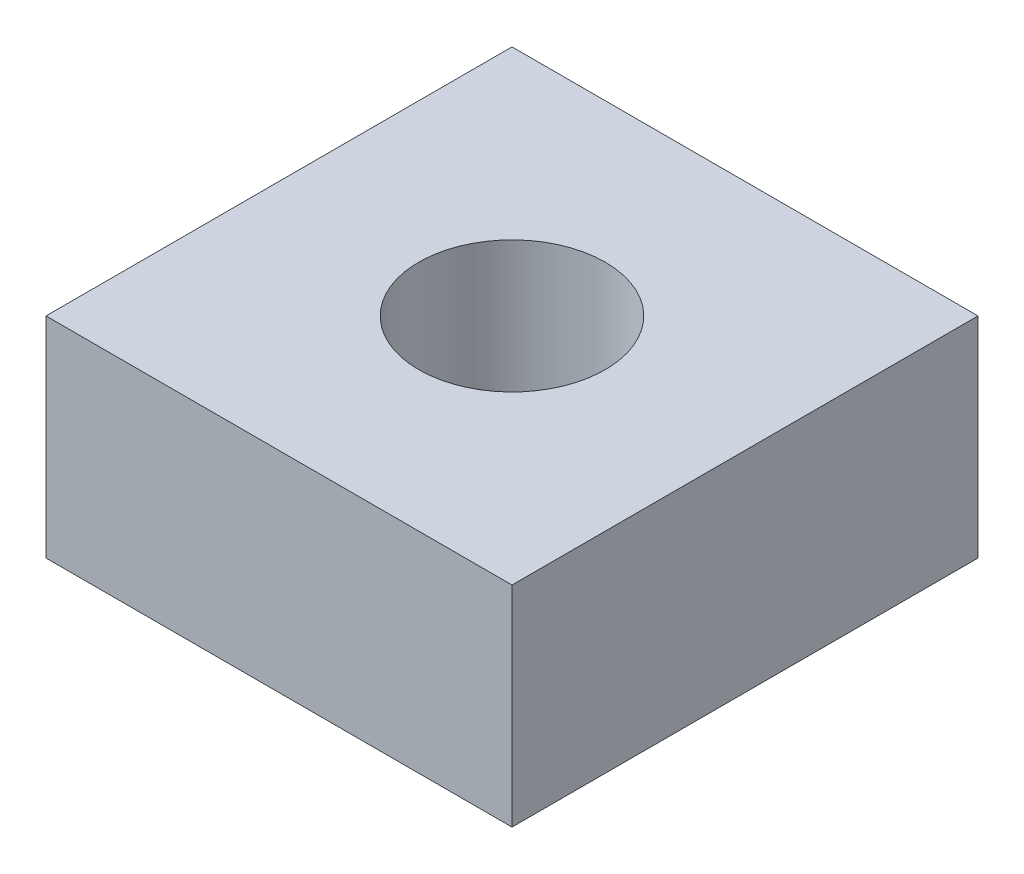
ISO-10303-21;
HEADER;
FILE_DESCRIPTION(('STEP AP214'),'2;1');
FILE_NAME('part.step','',(''),(''),'','','');
FILE_SCHEMA(('AUTOMOTIVE_DESIGN { 1 0 10303 214 1 1 1 1 }'));
ENDSEC;
DATA;
#1=APPLICATION_CONTEXT('core data for automotive mechanical design processes');
#2=APPLICATION_PROTOCOL_DEFINITION('international standard','automotive_design',2000,#1);
#3=PRODUCT_CONTEXT('',#1,'mechanical');
#4=PRODUCT('Part','Part','',(#3));
#5=PRODUCT_RELATED_PRODUCT_CATEGORY('part','',(#4));
#6=PRODUCT_DEFINITION_FORMATION('','',#4);
#7=PRODUCT_DEFINITION_CONTEXT('part definition',#1,'design');
#8=PRODUCT_DEFINITION('design','',#6,#7);
#9=PRODUCT_DEFINITION_SHAPE('','',#8);
#10=(LENGTH_UNIT() NAMED_UNIT(*) SI_UNIT(.MILLI.,.METRE.));
#11=(NAMED_UNIT(*) PLANE_ANGLE_UNIT() SI_UNIT($,.RADIAN.));
#12=(NAMED_UNIT(*) SI_UNIT($,.STERADIAN.) SOLID_ANGLE_UNIT());
#13=UNCERTAINTY_MEASURE_WITH_UNIT(LENGTH_MEASURE(1.E-05),#10,'distance_accuracy_value','');
#14=(GEOMETRIC_REPRESENTATION_CONTEXT(3) GLOBAL_UNCERTAINTY_ASSIGNED_CONTEXT((#13)) GLOBAL_UNIT_ASSIGNED_CONTEXT((#10,
#11,#12)) REPRESENTATION_CONTEXT('',''));
#15=CARTESIAN_POINT('',(0.,0.,0.));
#16=DIRECTION('',(0.,0.,1.));
#17=DIRECTION('',(1.,0.,0.));
#18=AXIS2_PLACEMENT_3D('',#15,#16,#17);
#19=CARTESIAN_POINT('',(0.,4.5,0.));
#20=DIRECTION('',(0.,1.,0.));
#21=DIRECTION('',(0.,0.,1.));
#22=AXIS2_PLACEMENT_3D('',#19,#20,#21);
#23=PLANE('',#22);
#24=DIRECTION('',(0.,0.,1.));
#25=VECTOR('',#24,1.);
#26=CARTESIAN_POINT('',(-5.,4.5,5.));
#27=LINE('',#26,#25);
#28=CARTESIAN_POINT('',(-5.,4.5,-5.));
#29=VERTEX_POINT('',#28);
#30=CARTESIAN_POINT('',(-5.,4.5,5.));
#31=VERTEX_POINT('',#30);
#32=EDGE_CURVE('E84',#29,#31,#27,.T.);
#33=ORIENTED_EDGE('',*,*,#32,.T.);
#34=DIRECTION('',(1.,0.,0.));
#35=VECTOR('',#34,1.);
#36=CARTESIAN_POINT('',(5.,4.5,5.));
#37=LINE('',#36,#35);
#38=CARTESIAN_POINT('',(5.,4.5,5.));
#39=VERTEX_POINT('',#38);
#40=EDGE_CURVE('E79',#31,#39,#37,.T.);
#41=ORIENTED_EDGE('',*,*,#40,.T.);
#42=DIRECTION('',(0.,0.,-1.));
#43=VECTOR('',#42,1.);
#44=CARTESIAN_POINT('',(5.,4.5,5.));
#45=LINE('',#44,#43);
#46=CARTESIAN_POINT('',(5.,4.5,-5.));
#47=VERTEX_POINT('',#46);
#48=EDGE_CURVE('E82',#39,#47,#45,.T.);
#49=ORIENTED_EDGE('',*,*,#48,.T.);
#50=DIRECTION('',(-1.,0.,0.));
#51=VECTOR('',#50,1.);
#52=CARTESIAN_POINT('',(5.,4.5,-5.));
#53=LINE('',#52,#51);
#54=EDGE_CURVE('E49',#47,#29,#53,.T.);
#55=ORIENTED_EDGE('',*,*,#54,.T.);
#56=EDGE_LOOP('',(#33,#41,#49,#55));
#57=FACE_BOUND('',#56,.T.);
#58=CARTESIAN_POINT('',(0.,4.5,0.));
#59=DIRECTION('',(0.,1.,0.));
#60=DIRECTION('',(0.,0.,1.));
#61=AXIS2_PLACEMENT_3D('',#58,#59,#60);
#62=CIRCLE('',#61,2.);
#63=CARTESIAN_POINT('',(0.,4.5,2.));
#64=VERTEX_POINT('',#63);
#65=EDGE_CURVE('E99',#64,#64,#62,.T.);
#66=ORIENTED_EDGE('',*,*,#65,.F.);
#67=EDGE_LOOP('',(#66));
#68=FACE_BOUND('',#67,.T.);
#69=ADVANCED_FACE('F32',(#57,#68),#23,.T.);
#70=CARTESIAN_POINT('',(0.,0.,0.));
#71=DIRECTION('',(0.,1.,0.));
#72=DIRECTION('',(0.,0.,1.));
#73=AXIS2_PLACEMENT_3D('',#70,#71,#72);
#74=PLANE('',#73);
#75=DIRECTION('',(0.,0.,1.));
#76=VECTOR('',#75,1.);
#77=CARTESIAN_POINT('',(-5.,0.,5.));
#78=LINE('',#77,#76);
#79=CARTESIAN_POINT('',(-5.,0.,-5.));
#80=VERTEX_POINT('',#79);
#81=CARTESIAN_POINT('',(-5.,0.,5.));
#82=VERTEX_POINT('',#81);
#83=EDGE_CURVE('E96',#80,#82,#78,.T.);
#84=ORIENTED_EDGE('',*,*,#83,.F.);
#85=DIRECTION('',(-1.,0.,0.));
#86=VECTOR('',#85,1.);
#87=CARTESIAN_POINT('',(5.,0.,-5.));
#88=LINE('',#87,#86);
#89=CARTESIAN_POINT('',(5.,0.,-5.));
#90=VERTEX_POINT('',#89);
#91=EDGE_CURVE('E72',#90,#80,#88,.T.);
#92=ORIENTED_EDGE('',*,*,#91,.F.);
#93=DIRECTION('',(0.,0.,-1.));
#94=VECTOR('',#93,1.);
#95=CARTESIAN_POINT('',(5.,0.,5.));
#96=LINE('',#95,#94);
#97=CARTESIAN_POINT('',(5.,0.,5.));
#98=VERTEX_POINT('',#97);
#99=EDGE_CURVE('E66',#98,#90,#96,.T.);
#100=ORIENTED_EDGE('',*,*,#99,.F.);
#101=DIRECTION('',(1.,0.,0.));
#102=VECTOR('',#101,1.);
#103=CARTESIAN_POINT('',(5.,0.,5.));
#104=LINE('',#103,#102);
#105=EDGE_CURVE('E88',#82,#98,#104,.T.);
#106=ORIENTED_EDGE('',*,*,#105,.F.);
#107=EDGE_LOOP('',(#84,#92,#100,#106));
#108=FACE_BOUND('',#107,.T.);
#109=CARTESIAN_POINT('',(0.,0.,0.));
#110=DIRECTION('',(0.,1.,0.));
#111=DIRECTION('',(0.,0.,1.));
#112=AXIS2_PLACEMENT_3D('',#109,#110,#111);
#113=CIRCLE('',#112,2.);
#114=CARTESIAN_POINT('',(0.,0.,2.));
#115=VERTEX_POINT('',#114);
#116=EDGE_CURVE('E111',#115,#115,#113,.T.);
#117=ORIENTED_EDGE('',*,*,#116,.T.);
#118=EDGE_LOOP('',(#117));
#119=FACE_BOUND('',#118,.T.);
#120=ADVANCED_FACE('F107',(#108,#119),#74,.F.);
#121=CARTESIAN_POINT('',(-5.,4.5,5.));
#122=DIRECTION('',(1.,0.,0.));
#123=DIRECTION('',(0.,0.,-1.));
#124=AXIS2_PLACEMENT_3D('',#121,#122,#123);
#125=PLANE('',#124);
#126=ORIENTED_EDGE('',*,*,#83,.T.);
#127=DIRECTION('',(0.,-1.,0.));
#128=VECTOR('',#127,1.);
#129=CARTESIAN_POINT('',(-5.,4.5,5.));
#130=LINE('',#129,#128);
#131=EDGE_CURVE('E11',#31,#82,#130,.T.);
#132=ORIENTED_EDGE('',*,*,#131,.F.);
#133=ORIENTED_EDGE('',*,*,#32,.F.);
#134=DIRECTION('',(0.,-1.,0.));
#135=VECTOR('',#134,1.);
#136=CARTESIAN_POINT('',(-5.,4.5,-5.));
#137=LINE('',#136,#135);
#138=EDGE_CURVE('E92',#29,#80,#137,.T.);
#139=ORIENTED_EDGE('',*,*,#138,.T.);
#140=EDGE_LOOP('',(#126,#132,#133,#139));
#141=FACE_BOUND('',#140,.T.);
#142=ADVANCED_FACE('F34',(#141),#125,.F.);
#143=CARTESIAN_POINT('',(5.,4.5,5.));
#144=DIRECTION('',(0.,0.,-1.));
#145=DIRECTION('',(-1.,0.,0.));
#146=AXIS2_PLACEMENT_3D('',#143,#144,#145);
#147=PLANE('',#146);
#148=ORIENTED_EDGE('',*,*,#105,.T.);
#149=DIRECTION('',(0.,-1.,0.));
#150=VECTOR('',#149,1.);
#151=CARTESIAN_POINT('',(5.,4.5,5.));
#152=LINE('',#151,#150);
#153=EDGE_CURVE('E41',#39,#98,#152,.T.);
#154=ORIENTED_EDGE('',*,*,#153,.F.);
#155=ORIENTED_EDGE('',*,*,#40,.F.);
#156=ORIENTED_EDGE('',*,*,#131,.T.);
#157=EDGE_LOOP('',(#148,#154,#155,#156));
#158=FACE_BOUND('',#157,.T.);
#159=ADVANCED_FACE('F87',(#158),#147,.F.);
#160=CARTESIAN_POINT('',(5.,4.5,5.));
#161=DIRECTION('',(-1.,0.,0.));
#162=DIRECTION('',(0.,0.,1.));
#163=AXIS2_PLACEMENT_3D('',#160,#161,#162);
#164=PLANE('',#163);
#165=ORIENTED_EDGE('',*,*,#99,.T.);
#166=DIRECTION('',(0.,-1.,0.));
#167=VECTOR('',#166,1.);
#168=CARTESIAN_POINT('',(5.,4.5,-5.));
#169=LINE('',#168,#167);
#170=EDGE_CURVE('E89',#47,#90,#169,.T.);
#171=ORIENTED_EDGE('',*,*,#170,.F.);
#172=ORIENTED_EDGE('',*,*,#48,.F.);
#173=ORIENTED_EDGE('',*,*,#153,.T.);
#174=EDGE_LOOP('',(#165,#171,#172,#173));
#175=FACE_BOUND('',#174,.T.);
#176=ADVANCED_FACE('F90',(#175),#164,.F.);
#177=CARTESIAN_POINT('',(5.,4.5,-5.));
#178=DIRECTION('',(0.,0.,1.));
#179=DIRECTION('',(1.,0.,0.));
#180=AXIS2_PLACEMENT_3D('',#177,#178,#179);
#181=PLANE('',#180);
#182=ORIENTED_EDGE('',*,*,#91,.T.);
#183=ORIENTED_EDGE('',*,*,#138,.F.);
#184=ORIENTED_EDGE('',*,*,#54,.F.);
#185=ORIENTED_EDGE('',*,*,#170,.T.);
#186=EDGE_LOOP('',(#182,#183,#184,#185));
#187=FACE_BOUND('',#186,.T.);
#188=ADVANCED_FACE('F104',(#187),#181,.F.);
#189=CARTESIAN_POINT('',(0.,4.5,0.));
#190=DIRECTION('',(0.,-1.,0.));
#191=DIRECTION('',(0.,0.,-1.));
#192=AXIS2_PLACEMENT_3D('',#189,#190,#191);
#193=CYLINDRICAL_SURFACE('',#192,2.);
#194=ORIENTED_EDGE('',*,*,#65,.T.);
#195=EDGE_LOOP('',(#194));
#196=FACE_BOUND('',#195,.T.);
#197=ORIENTED_EDGE('',*,*,#116,.F.);
#198=EDGE_LOOP('',(#197));
#199=FACE_BOUND('',#198,.T.);
#200=ADVANCED_FACE('F117',(#196,#199),#193,.F.);
#201=CLOSED_SHELL('',(#69,#120,#142,#159,#176,#188,#200));
#202=MANIFOLD_SOLID_BREP('B2',#201);
#203=ADVANCED_BREP_SHAPE_REPRESENTATION('',(#18,#202),#14);
#204=SHAPE_DEFINITION_REPRESENTATION(#9,#203);
ENDSEC;
END-ISO-10303-21;
